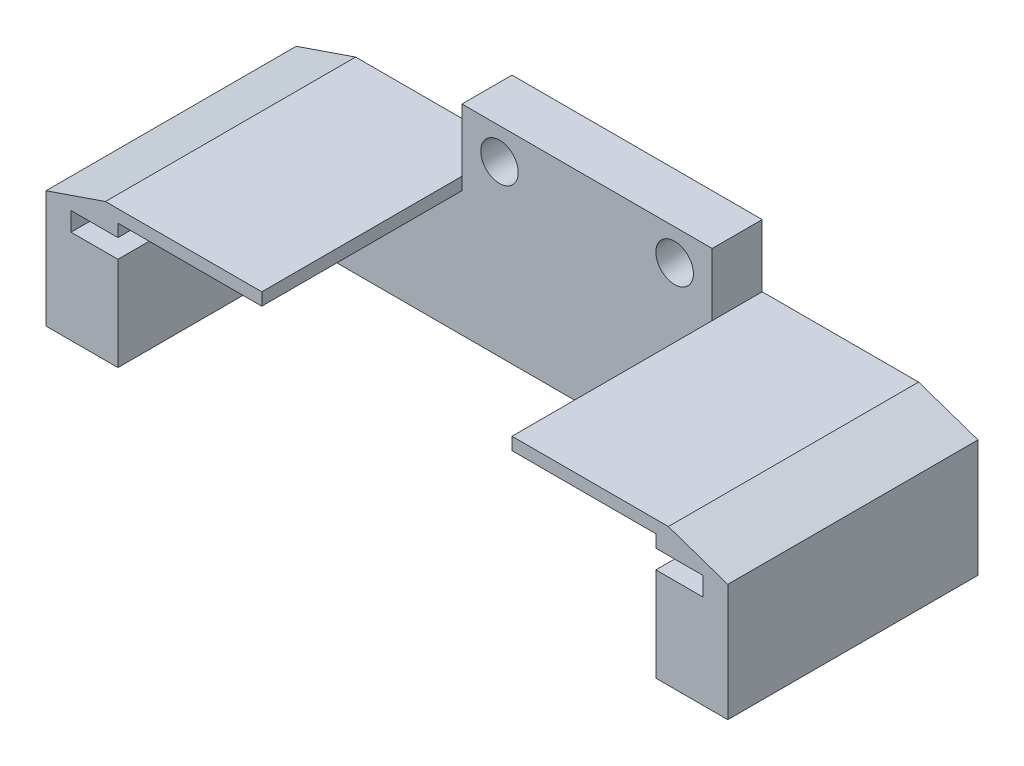
ISO-10303-21;
HEADER;
FILE_DESCRIPTION(('STEP AP214'),'2;1');
FILE_NAME('part.step','',(''),(''),'','','');
FILE_SCHEMA(('AUTOMOTIVE_DESIGN { 1 0 10303 214 1 1 1 1 }'));
ENDSEC;
DATA;
#1=APPLICATION_CONTEXT('core data for automotive mechanical design processes');
#2=APPLICATION_PROTOCOL_DEFINITION('international standard','automotive_design',2000,#1);
#3=PRODUCT_CONTEXT('',#1,'mechanical');
#4=PRODUCT('Part','Part','',(#3));
#5=PRODUCT_RELATED_PRODUCT_CATEGORY('part','',(#4));
#6=PRODUCT_DEFINITION_FORMATION('','',#4);
#7=PRODUCT_DEFINITION_CONTEXT('part definition',#1,'design');
#8=PRODUCT_DEFINITION('design','',#6,#7);
#9=PRODUCT_DEFINITION_SHAPE('','',#8);
#10=(LENGTH_UNIT() NAMED_UNIT(*) SI_UNIT(.MILLI.,.METRE.));
#11=(NAMED_UNIT(*) PLANE_ANGLE_UNIT() SI_UNIT($,.RADIAN.));
#12=(NAMED_UNIT(*) SI_UNIT($,.STERADIAN.) SOLID_ANGLE_UNIT());
#13=UNCERTAINTY_MEASURE_WITH_UNIT(LENGTH_MEASURE(1.E-05),#10,'distance_accuracy_value','');
#14=(GEOMETRIC_REPRESENTATION_CONTEXT(3) GLOBAL_UNCERTAINTY_ASSIGNED_CONTEXT((#13)) GLOBAL_UNIT_ASSIGNED_CONTEXT((#10,
#11,#12)) REPRESENTATION_CONTEXT('',''));
#15=CARTESIAN_POINT('',(0.,0.,0.));
#16=DIRECTION('',(0.,0.,1.));
#17=DIRECTION('',(1.,0.,0.));
#18=AXIS2_PLACEMENT_3D('',#15,#16,#17);
#19=CARTESIAN_POINT('',(-39.4079919345789,27.1123089983022,0.));
#20=DIRECTION('',(-1.,0.,0.));
#21=DIRECTION('',(0.,0.,1.));
#22=AXIS2_PLACEMENT_3D('',#19,#20,#21);
#23=PLANE('',#22);
#24=DIRECTION('',(0.,-1.,0.));
#25=VECTOR('',#24,1.);
#26=CARTESIAN_POINT('',(-39.4079919345789,26.1123089983022,1.));
#27=LINE('',#26,#25);
#28=CARTESIAN_POINT('',(-39.4079919345789,21.1123089983022,1.));
#29=VERTEX_POINT('',#28);
#30=CARTESIAN_POINT('',(-39.4079919345789,20.1123089983022,1.));
#31=VERTEX_POINT('',#30);
#32=EDGE_CURVE('E261',#29,#31,#27,.T.);
#33=ORIENTED_EDGE('',*,*,#32,.F.);
#34=DIRECTION('',(0.,0.,1.));
#35=VECTOR('',#34,1.);
#36=CARTESIAN_POINT('',(-39.4079919345789,21.1123089983022,0.));
#37=LINE('',#36,#35);
#38=CARTESIAN_POINT('',(-39.4079919345789,21.1123089983022,17.));
#39=VERTEX_POINT('',#38);
#40=EDGE_CURVE('E286',#29,#39,#37,.T.);
#41=ORIENTED_EDGE('',*,*,#40,.T.);
#42=DIRECTION('',(0.,-1.,0.));
#43=VECTOR('',#42,1.);
#44=CARTESIAN_POINT('',(-39.4079919345789,27.1123089983022,17.));
#45=LINE('',#44,#43);
#46=CARTESIAN_POINT('',(-39.4079919345789,20.1123089983022,17.));
#47=VERTEX_POINT('',#46);
#48=EDGE_CURVE('E292',#39,#47,#45,.T.);
#49=ORIENTED_EDGE('',*,*,#48,.T.);
#50=DIRECTION('',(0.,0.,1.));
#51=VECTOR('',#50,1.);
#52=CARTESIAN_POINT('',(-39.4079919345789,20.1123089983022,1.));
#53=LINE('',#52,#51);
#54=EDGE_CURVE('E41',#31,#47,#53,.T.);
#55=ORIENTED_EDGE('',*,*,#54,.F.);
#56=EDGE_LOOP('',(#33,#41,#49,#55));
#57=FACE_BOUND('',#56,.T.);
#58=ADVANCED_FACE('F33',(#57),#23,.F.);
#59=CARTESIAN_POINT('',(-19.4079919345789,27.1123089983022,0.));
#60=DIRECTION('',(1.,0.,0.));
#61=DIRECTION('',(0.,0.,-1.));
#62=AXIS2_PLACEMENT_3D('',#59,#60,#61);
#63=PLANE('',#62);
#64=DIRECTION('',(0.,-1.,0.));
#65=VECTOR('',#64,1.);
#66=CARTESIAN_POINT('',(-19.4079919345789,26.1123089983022,1.));
#67=LINE('',#66,#65);
#68=CARTESIAN_POINT('',(-19.4079919345789,21.1123089983022,1.));
#69=VERTEX_POINT('',#68);
#70=CARTESIAN_POINT('',(-19.4079919345789,20.1123089983022,1.));
#71=VERTEX_POINT('',#70);
#72=EDGE_CURVE('E257',#69,#71,#67,.T.);
#73=ORIENTED_EDGE('',*,*,#72,.T.);
#74=DIRECTION('',(0.,0.,-1.));
#75=VECTOR('',#74,1.);
#76=CARTESIAN_POINT('',(-19.4079919345789,20.1123089983022,1.));
#77=LINE('',#76,#75);
#78=CARTESIAN_POINT('',(-19.4079919345789,20.1123089983022,17.));
#79=VERTEX_POINT('',#78);
#80=EDGE_CURVE('E387',#79,#71,#77,.T.);
#81=ORIENTED_EDGE('',*,*,#80,.F.);
#82=DIRECTION('',(0.,1.,0.));
#83=VECTOR('',#82,1.);
#84=CARTESIAN_POINT('',(-19.4079919345789,27.1123089983022,17.));
#85=LINE('',#84,#83);
#86=CARTESIAN_POINT('',(-19.4079919345789,21.1123089983022,17.));
#87=VERTEX_POINT('',#86);
#88=EDGE_CURVE('E289',#79,#87,#85,.T.);
#89=ORIENTED_EDGE('',*,*,#88,.T.);
#90=DIRECTION('',(0.,0.,-1.));
#91=VECTOR('',#90,1.);
#92=CARTESIAN_POINT('',(-19.4079919345789,21.1123089983022,0.));
#93=LINE('',#92,#91);
#94=EDGE_CURVE('E11',#87,#69,#93,.T.);
#95=ORIENTED_EDGE('',*,*,#94,.T.);
#96=EDGE_LOOP('',(#73,#81,#89,#95));
#97=FACE_BOUND('',#96,.T.);
#98=ADVANCED_FACE('F460',(#97),#63,.F.);
#99=CARTESIAN_POINT('',(-50.9079919345788,10.1123089983022,1.));
#100=DIRECTION('',(-1.,0.,0.));
#101=DIRECTION('',(0.,0.,1.));
#102=AXIS2_PLACEMENT_3D('',#99,#100,#101);
#103=PLANE('',#102);
#104=DIRECTION('',(0.,-1.,0.));
#105=VECTOR('',#104,1.);
#106=CARTESIAN_POINT('',(-50.9079919345788,10.1123089983022,1.));
#107=LINE('',#106,#105);
#108=CARTESIAN_POINT('',(-50.9079919345788,17.6123089983022,1.));
#109=VERTEX_POINT('',#108);
#110=CARTESIAN_POINT('',(-50.9079919345788,10.1123089983022,1.));
#111=VERTEX_POINT('',#110);
#112=EDGE_CURVE('E345',#109,#111,#107,.T.);
#113=ORIENTED_EDGE('',*,*,#112,.F.);
#114=DIRECTION('',(0.,0.,1.));
#115=VECTOR('',#114,1.);
#116=CARTESIAN_POINT('',(-50.9079919345788,17.6123089983022,1.));
#117=LINE('',#116,#115);
#118=CARTESIAN_POINT('',(-50.9079919345788,17.6123089983022,17.));
#119=VERTEX_POINT('',#118);
#120=EDGE_CURVE('E337',#109,#119,#117,.T.);
#121=ORIENTED_EDGE('',*,*,#120,.T.);
#122=DIRECTION('',(0.,-1.,0.));
#123=VECTOR('',#122,1.);
#124=CARTESIAN_POINT('',(-50.9079919345788,10.1123089983022,17.));
#125=LINE('',#124,#123);
#126=CARTESIAN_POINT('',(-50.9079919345788,10.1123089983022,17.));
#127=VERTEX_POINT('',#126);
#128=EDGE_CURVE('E340',#119,#127,#125,.T.);
#129=ORIENTED_EDGE('',*,*,#128,.T.);
#130=DIRECTION('',(0.,0.,1.));
#131=VECTOR('',#130,1.);
#132=CARTESIAN_POINT('',(-50.9079919345788,10.1123089983022,1.));
#133=LINE('',#132,#131);
#134=EDGE_CURVE('E353',#111,#127,#133,.T.);
#135=ORIENTED_EDGE('',*,*,#134,.F.);
#136=EDGE_LOOP('',(#113,#121,#129,#135));
#137=FACE_BOUND('',#136,.T.);
#138=ADVANCED_FACE('F433',(#137),#103,.F.);
#139=CARTESIAN_POINT('',(-7.90799193457886,10.1123089983022,1.));
#140=DIRECTION('',(1.,0.,0.));
#141=DIRECTION('',(0.,1.,0.));
#142=AXIS2_PLACEMENT_3D('',#139,#140,#141);
#143=PLANE('',#142);
#144=DIRECTION('',(0.,1.,0.));
#145=VECTOR('',#144,1.);
#146=CARTESIAN_POINT('',(-7.90799193457886,10.1123089983022,17.));
#147=LINE('',#146,#145);
#148=CARTESIAN_POINT('',(-7.90799193457886,10.1123089983022,17.));
#149=VERTEX_POINT('',#148);
#150=CARTESIAN_POINT('',(-7.90799193457886,17.6123089983022,17.));
#151=VERTEX_POINT('',#150);
#152=EDGE_CURVE('E358',#149,#151,#147,.T.);
#153=ORIENTED_EDGE('',*,*,#152,.T.);
#154=DIRECTION('',(0.,0.,-1.));
#155=VECTOR('',#154,1.);
#156=CARTESIAN_POINT('',(-7.90799193457886,17.6123089983022,1.));
#157=LINE('',#156,#155);
#158=CARTESIAN_POINT('',(-7.90799193457886,17.6123089983022,1.));
#159=VERTEX_POINT('',#158);
#160=EDGE_CURVE('E384',#151,#159,#157,.T.);
#161=ORIENTED_EDGE('',*,*,#160,.T.);
#162=DIRECTION('',(0.,1.,0.));
#163=VECTOR('',#162,1.);
#164=CARTESIAN_POINT('',(-7.90799193457886,10.1123089983022,1.));
#165=LINE('',#164,#163);
#166=CARTESIAN_POINT('',(-7.90799193457886,10.1123089983022,1.));
#167=VERTEX_POINT('',#166);
#168=EDGE_CURVE('E346',#167,#159,#165,.T.);
#169=ORIENTED_EDGE('',*,*,#168,.F.);
#170=DIRECTION('',(0.,0.,1.));
#171=VECTOR('',#170,1.);
#172=CARTESIAN_POINT('',(-7.90799193457886,10.1123089983022,1.));
#173=LINE('',#172,#171);
#174=EDGE_CURVE('E372',#167,#149,#173,.T.);
#175=ORIENTED_EDGE('',*,*,#174,.T.);
#176=EDGE_LOOP('',(#153,#161,#169,#175));
#177=FACE_BOUND('',#176,.T.);
#178=ADVANCED_FACE('F501',(#177),#143,.F.);
#179=CARTESIAN_POINT('',(0.,0.,17.));
#180=DIRECTION('',(0.,0.,1.));
#181=DIRECTION('',(1.,0.,0.));
#182=AXIS2_PLACEMENT_3D('',#179,#180,#181);
#183=PLANE('',#182);
#184=DIRECTION('',(0.,-1.,0.));
#185=VECTOR('',#184,1.);
#186=CARTESIAN_POINT('',(-2.15799193457886,19.7408804268736,17.));
#187=LINE('',#186,#185);
#188=CARTESIAN_POINT('',(-2.15799193457886,19.4837375697308,17.));
#189=VERTEX_POINT('',#188);
#190=CARTESIAN_POINT('',(-2.15799193457886,10.1123089983022,17.));
#191=VERTEX_POINT('',#190);
#192=EDGE_CURVE('E228',#189,#191,#187,.T.);
#193=ORIENTED_EDGE('',*,*,#192,.F.);
#194=DIRECTION('',(0.945945945945946,-0.324324324324323,0.));
#195=VECTOR('',#194,1.);
#196=CARTESIAN_POINT('',(-6.90799193457886,21.1123089983022,17.));
#197=LINE('',#196,#195);
#198=CARTESIAN_POINT('',(-6.90799193457886,21.1123089983022,17.));
#199=VERTEX_POINT('',#198);
#200=EDGE_CURVE('E48',#199,#189,#197,.T.);
#201=ORIENTED_EDGE('',*,*,#200,.F.);
#202=DIRECTION('',(1.,0.,0.));
#203=VECTOR('',#202,1.);
#204=CARTESIAN_POINT('',(-3.90799193457886,21.1123089983022,17.));
#205=LINE('',#204,#203);
#206=EDGE_CURVE('E297',#87,#199,#205,.T.);
#207=ORIENTED_EDGE('',*,*,#206,.F.);
#208=ORIENTED_EDGE('',*,*,#88,.F.);
#209=DIRECTION('',(-1.,0.,0.));
#210=VECTOR('',#209,1.);
#211=CARTESIAN_POINT('',(-50.9079919345788,20.1123089983022,17.));
#212=LINE('',#211,#210);
#213=CARTESIAN_POINT('',(-7.90799193457886,20.1123089983022,17.));
#214=VERTEX_POINT('',#213);
#215=EDGE_CURVE('E362',#214,#79,#212,.T.);
#216=ORIENTED_EDGE('',*,*,#215,.F.);
#217=CARTESIAN_POINT('',(-7.90799193457886,19.1123089983022,17.));
#218=VERTEX_POINT('',#217);
#219=EDGE_CURVE('E357',#218,#214,#147,.T.);
#220=ORIENTED_EDGE('',*,*,#219,.F.);
#221=DIRECTION('',(-1.,0.,0.));
#222=VECTOR('',#221,1.);
#223=CARTESIAN_POINT('',(-4.15799193457886,19.1123089983022,17.));
#224=LINE('',#223,#222);
#225=CARTESIAN_POINT('',(-4.15799193457886,19.1123089983022,17.));
#226=VERTEX_POINT('',#225);
#227=EDGE_CURVE('E318',#226,#218,#224,.T.);
#228=ORIENTED_EDGE('',*,*,#227,.F.);
#229=DIRECTION('',(0.,1.,0.));
#230=VECTOR('',#229,1.);
#231=CARTESIAN_POINT('',(-4.15799193457886,17.6123089983022,17.));
#232=LINE('',#231,#230);
#233=CARTESIAN_POINT('',(-4.15799193457886,17.6123089983022,17.));
#234=VERTEX_POINT('',#233);
#235=EDGE_CURVE('E300',#234,#226,#232,.T.);
#236=ORIENTED_EDGE('',*,*,#235,.F.);
#237=DIRECTION('',(1.,0.,0.));
#238=VECTOR('',#237,1.);
#239=CARTESIAN_POINT('',(-4.15799193457886,17.6123089983022,17.));
#240=LINE('',#239,#238);
#241=EDGE_CURVE('E323',#151,#234,#240,.T.);
#242=ORIENTED_EDGE('',*,*,#241,.F.);
#243=ORIENTED_EDGE('',*,*,#152,.F.);
#244=DIRECTION('',(1.,0.,0.));
#245=VECTOR('',#244,1.);
#246=CARTESIAN_POINT('',(-54.9079919345788,10.1123089983022,17.));
#247=LINE('',#246,#245);
#248=EDGE_CURVE('E377',#149,#191,#247,.T.);
#249=ORIENTED_EDGE('',*,*,#248,.T.);
#250=EDGE_LOOP('',(#193,#201,#207,#208,#216,#220,#228,#236,#242,#243,#249));
#251=FACE_BOUND('',#250,.T.);
#252=ADVANCED_FACE('F481',(#251),#183,.T.);
#253=CARTESIAN_POINT('',(-54.9079919345788,10.1123089983022,17.));
#254=DIRECTION('',(0.,1.,0.));
#255=DIRECTION('',(0.,0.,1.));
#256=AXIS2_PLACEMENT_3D('',#253,#254,#255);
#257=PLANE('',#256);
#258=ORIENTED_EDGE('',*,*,#248,.F.);
#259=ORIENTED_EDGE('',*,*,#174,.F.);
#260=DIRECTION('',(1.,0.,0.));
#261=VECTOR('',#260,1.);
#262=CARTESIAN_POINT('',(-36.9079919345788,10.1123089983022,1.));
#263=LINE('',#262,#261);
#264=EDGE_CURVE('E368',#111,#167,#263,.T.);
#265=ORIENTED_EDGE('',*,*,#264,.F.);
#266=ORIENTED_EDGE('',*,*,#134,.T.);
#267=CARTESIAN_POINT('',(-56.6579919345789,10.1123089983022,17.));
#268=VERTEX_POINT('',#267);
#269=EDGE_CURVE('E378',#268,#127,#247,.T.);
#270=ORIENTED_EDGE('',*,*,#269,.F.);
#271=DIRECTION('',(0.,0.,1.));
#272=VECTOR('',#271,1.);
#273=CARTESIAN_POINT('',(-56.6579919345789,10.1123089983022,17.));
#274=LINE('',#273,#272);
#275=CARTESIAN_POINT('',(-56.6579919345789,10.1123089983022,-3.));
#276=VERTEX_POINT('',#275);
#277=EDGE_CURVE('E233',#276,#268,#274,.T.);
#278=ORIENTED_EDGE('',*,*,#277,.F.);
#279=DIRECTION('',(-1.,0.,0.));
#280=VECTOR('',#279,1.);
#281=CARTESIAN_POINT('',(-2.90799193457886,10.1123089983022,-3.));
#282=LINE('',#281,#280);
#283=CARTESIAN_POINT('',(-2.15799193457886,10.1123089983022,-3.));
#284=VERTEX_POINT('',#283);
#285=EDGE_CURVE('E271',#284,#276,#282,.T.);
#286=ORIENTED_EDGE('',*,*,#285,.F.);
#287=DIRECTION('',(0.,0.,-1.));
#288=VECTOR('',#287,1.);
#289=CARTESIAN_POINT('',(-2.15799193457886,10.1123089983022,17.));
#290=LINE('',#289,#288);
#291=EDGE_CURVE('E222',#191,#284,#290,.T.);
#292=ORIENTED_EDGE('',*,*,#291,.F.);
#293=EDGE_LOOP('',(#258,#259,#265,#266,#270,#278,#286,#292));
#294=FACE_BOUND('',#293,.T.);
#295=ADVANCED_FACE('F35',(#294),#257,.F.);
#296=DIRECTION('',(0.945945945945946,0.324324324324324,0.));
#297=VECTOR('',#296,1.);
#298=CARTESIAN_POINT('',(-55.9079919345788,19.7408804268736,17.));
#299=LINE('',#298,#297);
#300=CARTESIAN_POINT('',(-56.6579919345789,19.4837375697308,17.));
#301=VERTEX_POINT('',#300);
#302=CARTESIAN_POINT('',(-51.9079919345788,21.1123089983022,17.));
#303=VERTEX_POINT('',#302);
#304=EDGE_CURVE('E281',#301,#303,#299,.T.);
#305=ORIENTED_EDGE('',*,*,#304,.F.);
#306=DIRECTION('',(0.,1.,0.));
#307=VECTOR('',#306,1.);
#308=CARTESIAN_POINT('',(-56.6579919345789,19.7408804268736,17.));
#309=LINE('',#308,#307);
#310=EDGE_CURVE('E223',#268,#301,#309,.T.);
#311=ORIENTED_EDGE('',*,*,#310,.F.);
#312=ORIENTED_EDGE('',*,*,#269,.T.);
#313=ORIENTED_EDGE('',*,*,#128,.F.);
#314=CARTESIAN_POINT('',(-54.6579919345788,17.6123089983022,17.));
#315=VERTEX_POINT('',#314);
#316=EDGE_CURVE('E305',#315,#119,#240,.T.);
#317=ORIENTED_EDGE('',*,*,#316,.F.);
#318=DIRECTION('',(0.,-1.,0.));
#319=VECTOR('',#318,1.);
#320=CARTESIAN_POINT('',(-54.6579919345788,17.6123089983022,17.));
#321=LINE('',#320,#319);
#322=CARTESIAN_POINT('',(-54.6579919345788,19.1123089983022,17.));
#323=VERTEX_POINT('',#322);
#324=EDGE_CURVE('E320',#323,#315,#321,.T.);
#325=ORIENTED_EDGE('',*,*,#324,.F.);
#326=CARTESIAN_POINT('',(-50.9079919345788,19.1123089983022,17.));
#327=VERTEX_POINT('',#326);
#328=EDGE_CURVE('E317',#327,#323,#224,.T.);
#329=ORIENTED_EDGE('',*,*,#328,.F.);
#330=CARTESIAN_POINT('',(-50.9079919345788,20.1123089983022,17.));
#331=VERTEX_POINT('',#330);
#332=EDGE_CURVE('E354',#331,#327,#125,.T.);
#333=ORIENTED_EDGE('',*,*,#332,.F.);
#334=EDGE_CURVE('E361',#47,#331,#212,.T.);
#335=ORIENTED_EDGE('',*,*,#334,.F.);
#336=ORIENTED_EDGE('',*,*,#48,.F.);
#337=DIRECTION('',(1.,0.,0.));
#338=VECTOR('',#337,1.);
#339=CARTESIAN_POINT('',(-54.9079919345788,21.1123089983022,17.));
#340=LINE('',#339,#338);
#341=EDGE_CURVE('E294',#303,#39,#340,.T.);
#342=ORIENTED_EDGE('',*,*,#341,.F.);
#343=EDGE_LOOP('',(#305,#311,#312,#313,#317,#325,#329,#333,#335,#336,#342));
#344=FACE_BOUND('',#343,.T.);
#345=ADVANCED_FACE('F401',(#344),#183,.T.);
#346=CARTESIAN_POINT('',(-36.9079919345788,27.1123089983022,1.));
#347=DIRECTION('',(0.,0.,-1.));
#348=DIRECTION('',(-1.,0.,0.));
#349=AXIS2_PLACEMENT_3D('',#346,#347,#348);
#350=PLANE('',#349);
#351=CARTESIAN_POINT('',(-22.4079919345789,23.6123089983022,1.));
#352=DIRECTION('',(0.,0.,1.));
#353=DIRECTION('',(1.,0.,0.));
#354=AXIS2_PLACEMENT_3D('',#351,#352,#353);
#355=CIRCLE('',#354,1.5);
#356=CARTESIAN_POINT('',(-20.9079919345789,23.6123089983022,1.));
#357=VERTEX_POINT('',#356);
#358=EDGE_CURVE('E236',#357,#357,#355,.T.);
#359=ORIENTED_EDGE('',*,*,#358,.F.);
#360=EDGE_LOOP('',(#359));
#361=FACE_BOUND('',#360,.T.);
#362=CARTESIAN_POINT('',(-36.4079919345789,23.6123089983022,1.));
#363=DIRECTION('',(0.,0.,1.));
#364=DIRECTION('',(1.,0.,0.));
#365=AXIS2_PLACEMENT_3D('',#362,#363,#364);
#366=CIRCLE('',#365,1.5);
#367=CARTESIAN_POINT('',(-34.9079919345789,23.6123089983022,1.));
#368=VERTEX_POINT('',#367);
#369=EDGE_CURVE('E240',#368,#368,#366,.T.);
#370=ORIENTED_EDGE('',*,*,#369,.F.);
#371=EDGE_LOOP('',(#370));
#372=FACE_BOUND('',#371,.T.);
#373=DIRECTION('',(-1.,0.,0.));
#374=VECTOR('',#373,1.);
#375=CARTESIAN_POINT('',(-50.9079919345788,20.1123089983022,1.));
#376=LINE('',#375,#374);
#377=CARTESIAN_POINT('',(-7.90799193457886,20.1123089983022,1.));
#378=VERTEX_POINT('',#377);
#379=EDGE_CURVE('E350',#378,#71,#376,.T.);
#380=ORIENTED_EDGE('',*,*,#379,.T.);
#381=ORIENTED_EDGE('',*,*,#72,.F.);
#382=CARTESIAN_POINT('',(-19.4079919345789,26.1123089983022,1.));
#383=VERTEX_POINT('',#382);
#384=EDGE_CURVE('E258',#383,#69,#67,.T.);
#385=ORIENTED_EDGE('',*,*,#384,.F.);
#386=DIRECTION('',(1.,0.,0.));
#387=VECTOR('',#386,1.);
#388=CARTESIAN_POINT('',(-19.4079919345789,26.1123089983022,1.));
#389=LINE('',#388,#387);
#390=CARTESIAN_POINT('',(-39.4079919345789,26.1123089983022,1.));
#391=VERTEX_POINT('',#390);
#392=EDGE_CURVE('E255',#391,#383,#389,.T.);
#393=ORIENTED_EDGE('',*,*,#392,.F.);
#394=EDGE_CURVE('E262',#391,#29,#27,.T.);
#395=ORIENTED_EDGE('',*,*,#394,.T.);
#396=ORIENTED_EDGE('',*,*,#32,.T.);
#397=CARTESIAN_POINT('',(-50.9079919345788,20.1123089983022,1.));
#398=VERTEX_POINT('',#397);
#399=EDGE_CURVE('E349',#31,#398,#376,.T.);
#400=ORIENTED_EDGE('',*,*,#399,.T.);
#401=CARTESIAN_POINT('',(-50.9079919345788,19.1123089983022,1.));
#402=VERTEX_POINT('',#401);
#403=EDGE_CURVE('E341',#398,#402,#107,.T.);
#404=ORIENTED_EDGE('',*,*,#403,.T.);
#405=DIRECTION('',(-1.,0.,0.));
#406=VECTOR('',#405,1.);
#407=CARTESIAN_POINT('',(-4.15799193457886,19.1123089983022,1.));
#408=LINE('',#407,#406);
#409=CARTESIAN_POINT('',(-54.6579919345788,19.1123089983022,1.));
#410=VERTEX_POINT('',#409);
#411=EDGE_CURVE('E304',#402,#410,#408,.T.);
#412=ORIENTED_EDGE('',*,*,#411,.T.);
#413=DIRECTION('',(0.,-1.,0.));
#414=VECTOR('',#413,1.);
#415=CARTESIAN_POINT('',(-54.6579919345788,17.6123089983022,1.));
#416=LINE('',#415,#414);
#417=CARTESIAN_POINT('',(-54.6579919345788,17.6123089983022,1.));
#418=VERTEX_POINT('',#417);
#419=EDGE_CURVE('E308',#410,#418,#416,.T.);
#420=ORIENTED_EDGE('',*,*,#419,.T.);
#421=DIRECTION('',(1.,0.,0.));
#422=VECTOR('',#421,1.);
#423=CARTESIAN_POINT('',(-4.15799193457886,17.6123089983022,1.));
#424=LINE('',#423,#422);
#425=EDGE_CURVE('E312',#418,#109,#424,.T.);
#426=ORIENTED_EDGE('',*,*,#425,.T.);
#427=ORIENTED_EDGE('',*,*,#112,.T.);
#428=ORIENTED_EDGE('',*,*,#264,.T.);
#429=ORIENTED_EDGE('',*,*,#168,.T.);
#430=CARTESIAN_POINT('',(-4.15799193457886,17.6123089983022,1.));
#431=VERTEX_POINT('',#430);
#432=EDGE_CURVE('E311',#159,#431,#424,.T.);
#433=ORIENTED_EDGE('',*,*,#432,.T.);
#434=DIRECTION('',(0.,1.,0.));
#435=VECTOR('',#434,1.);
#436=CARTESIAN_POINT('',(-4.15799193457886,17.6123089983022,1.));
#437=LINE('',#436,#435);
#438=CARTESIAN_POINT('',(-4.15799193457886,19.1123089983022,1.));
#439=VERTEX_POINT('',#438);
#440=EDGE_CURVE('E301',#431,#439,#437,.T.);
#441=ORIENTED_EDGE('',*,*,#440,.T.);
#442=CARTESIAN_POINT('',(-7.90799193457886,19.1123089983022,1.));
#443=VERTEX_POINT('',#442);
#444=EDGE_CURVE('E306',#439,#443,#408,.T.);
#445=ORIENTED_EDGE('',*,*,#444,.T.);
#446=EDGE_CURVE('E344',#443,#378,#165,.T.);
#447=ORIENTED_EDGE('',*,*,#446,.T.);
#448=EDGE_LOOP('',(#380,#381,#385,#393,#395,#396,#400,#404,#412,#420,#426,#427,#428,#429,#433,
#441,#445,#447));
#449=FACE_BOUND('',#448,.T.);
#450=ADVANCED_FACE('F409',(#361,#372,#449),#350,.F.);
#451=CARTESIAN_POINT('',(-50.9079919345788,20.1123089983022,1.));
#452=DIRECTION('',(0.,1.,0.));
#453=DIRECTION('',(0.,0.,1.));
#454=AXIS2_PLACEMENT_3D('',#451,#452,#453);
#455=PLANE('',#454);
#456=ORIENTED_EDGE('',*,*,#399,.F.);
#457=ORIENTED_EDGE('',*,*,#54,.T.);
#458=ORIENTED_EDGE('',*,*,#334,.T.);
#459=DIRECTION('',(0.,0.,1.));
#460=VECTOR('',#459,1.);
#461=CARTESIAN_POINT('',(-50.9079919345788,20.1123089983022,1.));
#462=LINE('',#461,#460);
#463=EDGE_CURVE('E365',#398,#331,#462,.T.);
#464=ORIENTED_EDGE('',*,*,#463,.F.);
#465=EDGE_LOOP('',(#456,#457,#458,#464));
#466=FACE_BOUND('',#465,.T.);
#467=ADVANCED_FACE('F394',(#466),#455,.F.);
#468=ORIENTED_EDGE('',*,*,#332,.T.);
#469=DIRECTION('',(0.,0.,-1.));
#470=VECTOR('',#469,1.);
#471=CARTESIAN_POINT('',(-50.9079919345788,19.1123089983022,1.));
#472=LINE('',#471,#470);
#473=EDGE_CURVE('E328',#327,#402,#472,.T.);
#474=ORIENTED_EDGE('',*,*,#473,.T.);
#475=ORIENTED_EDGE('',*,*,#403,.F.);
#476=ORIENTED_EDGE('',*,*,#463,.T.);
#477=EDGE_LOOP('',(#468,#474,#475,#476));
#478=FACE_BOUND('',#477,.T.);
#479=ADVANCED_FACE('F406',(#478),#103,.F.);
#480=ORIENTED_EDGE('',*,*,#215,.T.);
#481=ORIENTED_EDGE('',*,*,#80,.T.);
#482=ORIENTED_EDGE('',*,*,#379,.F.);
#483=DIRECTION('',(0.,0.,1.));
#484=VECTOR('',#483,1.);
#485=CARTESIAN_POINT('',(-7.90799193457886,20.1123089983022,1.));
#486=LINE('',#485,#484);
#487=EDGE_CURVE('E369',#378,#214,#486,.T.);
#488=ORIENTED_EDGE('',*,*,#487,.T.);
#489=EDGE_LOOP('',(#480,#481,#482,#488));
#490=FACE_BOUND('',#489,.T.);
#491=ADVANCED_FACE('F484',(#490),#455,.F.);
#492=ORIENTED_EDGE('',*,*,#446,.F.);
#493=DIRECTION('',(0.,0.,1.));
#494=VECTOR('',#493,1.);
#495=CARTESIAN_POINT('',(-7.90799193457886,19.1123089983022,1.));
#496=LINE('',#495,#494);
#497=EDGE_CURVE('E381',#443,#218,#496,.T.);
#498=ORIENTED_EDGE('',*,*,#497,.T.);
#499=ORIENTED_EDGE('',*,*,#219,.T.);
#500=ORIENTED_EDGE('',*,*,#487,.F.);
#501=EDGE_LOOP('',(#492,#498,#499,#500));
#502=FACE_BOUND('',#501,.T.);
#503=ADVANCED_FACE('F457',(#502),#143,.F.);
#504=CARTESIAN_POINT('',(-4.15799193457886,19.1123089983022,1.));
#505=DIRECTION('',(0.,1.,0.));
#506=DIRECTION('',(-1.,0.,0.));
#507=AXIS2_PLACEMENT_3D('',#504,#505,#506);
#508=PLANE('',#507);
#509=ORIENTED_EDGE('',*,*,#444,.F.);
#510=DIRECTION('',(0.,0.,1.));
#511=VECTOR('',#510,1.);
#512=CARTESIAN_POINT('',(-4.15799193457886,19.1123089983022,1.));
#513=LINE('',#512,#511);
#514=EDGE_CURVE('E314',#439,#226,#513,.T.);
#515=ORIENTED_EDGE('',*,*,#514,.T.);
#516=ORIENTED_EDGE('',*,*,#227,.T.);
#517=ORIENTED_EDGE('',*,*,#497,.F.);
#518=EDGE_LOOP('',(#509,#515,#516,#517));
#519=FACE_BOUND('',#518,.T.);
#520=ADVANCED_FACE('F445',(#519),#508,.F.);
#521=CARTESIAN_POINT('',(-4.15799193457886,17.6123089983022,1.));
#522=DIRECTION('',(0.,-1.,0.));
#523=DIRECTION('',(1.,0.,0.));
#524=AXIS2_PLACEMENT_3D('',#521,#522,#523);
#525=PLANE('',#524);
#526=ORIENTED_EDGE('',*,*,#241,.T.);
#527=DIRECTION('',(0.,0.,1.));
#528=VECTOR('',#527,1.);
#529=CARTESIAN_POINT('',(-4.15799193457886,17.6123089983022,1.));
#530=LINE('',#529,#528);
#531=EDGE_CURVE('E325',#431,#234,#530,.T.);
#532=ORIENTED_EDGE('',*,*,#531,.F.);
#533=ORIENTED_EDGE('',*,*,#432,.F.);
#534=ORIENTED_EDGE('',*,*,#160,.F.);
#535=EDGE_LOOP('',(#526,#532,#533,#534));
#536=FACE_BOUND('',#535,.T.);
#537=ADVANCED_FACE('F454',(#536),#525,.F.);
#538=CARTESIAN_POINT('',(-4.15799193457886,17.6123089983022,1.));
#539=DIRECTION('',(1.,0.,0.));
#540=DIRECTION('',(0.,0.,-1.));
#541=AXIS2_PLACEMENT_3D('',#538,#539,#540);
#542=PLANE('',#541);
#543=ORIENTED_EDGE('',*,*,#235,.T.);
#544=ORIENTED_EDGE('',*,*,#514,.F.);
#545=ORIENTED_EDGE('',*,*,#440,.F.);
#546=ORIENTED_EDGE('',*,*,#531,.T.);
#547=EDGE_LOOP('',(#543,#544,#545,#546));
#548=FACE_BOUND('',#547,.T.);
#549=ADVANCED_FACE('F452',(#548),#542,.F.);
#550=ORIENTED_EDGE('',*,*,#425,.F.);
#551=DIRECTION('',(0.,0.,1.));
#552=VECTOR('',#551,1.);
#553=CARTESIAN_POINT('',(-54.6579919345788,17.6123089983022,1.));
#554=LINE('',#553,#552);
#555=EDGE_CURVE('E329',#418,#315,#554,.T.);
#556=ORIENTED_EDGE('',*,*,#555,.T.);
#557=ORIENTED_EDGE('',*,*,#316,.T.);
#558=ORIENTED_EDGE('',*,*,#120,.F.);
#559=EDGE_LOOP('',(#550,#556,#557,#558));
#560=FACE_BOUND('',#559,.T.);
#561=ADVANCED_FACE('F437',(#560),#525,.F.);
#562=ORIENTED_EDGE('',*,*,#328,.T.);
#563=DIRECTION('',(0.,0.,1.));
#564=VECTOR('',#563,1.);
#565=CARTESIAN_POINT('',(-54.6579919345788,19.1123089983022,1.));
#566=LINE('',#565,#564);
#567=EDGE_CURVE('E331',#410,#323,#566,.T.);
#568=ORIENTED_EDGE('',*,*,#567,.F.);
#569=ORIENTED_EDGE('',*,*,#411,.F.);
#570=ORIENTED_EDGE('',*,*,#473,.F.);
#571=EDGE_LOOP('',(#562,#568,#569,#570));
#572=FACE_BOUND('',#571,.T.);
#573=ADVANCED_FACE('F442',(#572),#508,.F.);
#574=CARTESIAN_POINT('',(-54.6579919345788,17.6123089983022,1.));
#575=DIRECTION('',(-1.,0.,0.));
#576=DIRECTION('',(0.,0.,1.));
#577=AXIS2_PLACEMENT_3D('',#574,#575,#576);
#578=PLANE('',#577);
#579=ORIENTED_EDGE('',*,*,#324,.T.);
#580=ORIENTED_EDGE('',*,*,#555,.F.);
#581=ORIENTED_EDGE('',*,*,#419,.F.);
#582=ORIENTED_EDGE('',*,*,#567,.T.);
#583=EDGE_LOOP('',(#579,#580,#581,#582));
#584=FACE_BOUND('',#583,.T.);
#585=ADVANCED_FACE('F440',(#584),#578,.F.);
#586=CARTESIAN_POINT('',(-3.90799193457886,21.1123089983022,0.));
#587=DIRECTION('',(0.,-1.,0.));
#588=DIRECTION('',(0.,0.,-1.));
#589=AXIS2_PLACEMENT_3D('',#586,#587,#588);
#590=PLANE('',#589);
#591=ORIENTED_EDGE('',*,*,#94,.F.);
#592=ORIENTED_EDGE('',*,*,#206,.T.);
#593=DIRECTION('',(0.,0.,1.));
#594=VECTOR('',#593,1.);
#595=CARTESIAN_POINT('',(-6.90799193457886,21.1123089983022,0.));
#596=LINE('',#595,#594);
#597=CARTESIAN_POINT('',(-6.90799193457886,21.1123089983022,-3.));
#598=VERTEX_POINT('',#597);
#599=EDGE_CURVE('E279',#598,#199,#596,.T.);
#600=ORIENTED_EDGE('',*,*,#599,.F.);
#601=DIRECTION('',(1.,0.,0.));
#602=VECTOR('',#601,1.);
#603=CARTESIAN_POINT('',(-19.4079919345789,21.1123089983022,-3.));
#604=LINE('',#603,#602);
#605=CARTESIAN_POINT('',(-19.4079919345789,21.1123089983022,-3.));
#606=VERTEX_POINT('',#605);
#607=EDGE_CURVE('E211',#606,#598,#604,.T.);
#608=ORIENTED_EDGE('',*,*,#607,.F.);
#609=DIRECTION('',(0.,0.,-1.));
#610=VECTOR('',#609,1.);
#611=CARTESIAN_POINT('',(-19.4079919345789,21.1123089983022,0.));
#612=LINE('',#611,#610);
#613=EDGE_CURVE('E269',#69,#606,#612,.T.);
#614=ORIENTED_EDGE('',*,*,#613,.F.);
#615=EDGE_LOOP('',(#591,#592,#600,#608,#614));
#616=FACE_BOUND('',#615,.T.);
#617=ADVANCED_FACE('F450',(#616),#590,.F.);
#618=CARTESIAN_POINT('',(-54.9079919345788,21.1123089983022,0.));
#619=DIRECTION('',(0.,-1.,0.));
#620=DIRECTION('',(0.,0.,-1.));
#621=AXIS2_PLACEMENT_3D('',#618,#619,#620);
#622=PLANE('',#621);
#623=ORIENTED_EDGE('',*,*,#341,.T.);
#624=ORIENTED_EDGE('',*,*,#40,.F.);
#625=CARTESIAN_POINT('',(-39.4079919345789,21.1123089983022,-3.));
#626=VERTEX_POINT('',#625);
#627=EDGE_CURVE('E287',#626,#29,#37,.T.);
#628=ORIENTED_EDGE('',*,*,#627,.F.);
#629=DIRECTION('',(1.,0.,0.));
#630=VECTOR('',#629,1.);
#631=CARTESIAN_POINT('',(-51.9079919345788,21.1123089983022,-3.));
#632=LINE('',#631,#630);
#633=CARTESIAN_POINT('',(-51.9079919345788,21.1123089983022,-3.));
#634=VERTEX_POINT('',#633);
#635=EDGE_CURVE('E274',#634,#626,#632,.T.);
#636=ORIENTED_EDGE('',*,*,#635,.F.);
#637=DIRECTION('',(0.,0.,1.));
#638=VECTOR('',#637,1.);
#639=CARTESIAN_POINT('',(-51.9079919345788,21.1123089983022,0.));
#640=LINE('',#639,#638);
#641=EDGE_CURVE('E283',#634,#303,#640,.T.);
#642=ORIENTED_EDGE('',*,*,#641,.T.);
#643=EDGE_LOOP('',(#623,#624,#628,#636,#642));
#644=FACE_BOUND('',#643,.T.);
#645=ADVANCED_FACE('F416',(#644),#622,.F.);
#646=CARTESIAN_POINT('',(-55.9079919345788,19.7408804268736,0.));
#647=DIRECTION('',(0.324324324324324,-0.945945945945946,0.));
#648=DIRECTION('',(0.945945945945946,0.324324324324324,0.));
#649=AXIS2_PLACEMENT_3D('',#646,#647,#648);
#650=PLANE('',#649);
#651=ORIENTED_EDGE('',*,*,#304,.T.);
#652=ORIENTED_EDGE('',*,*,#641,.F.);
#653=DIRECTION('',(0.945945945945946,0.324324324324324,0.));
#654=VECTOR('',#653,1.);
#655=CARTESIAN_POINT('',(-55.9079919345788,19.7408804268736,-3.));
#656=LINE('',#655,#654);
#657=CARTESIAN_POINT('',(-56.6579919345789,19.4837375697308,-3.));
#658=VERTEX_POINT('',#657);
#659=EDGE_CURVE('E56',#658,#634,#656,.T.);
#660=ORIENTED_EDGE('',*,*,#659,.F.);
#661=DIRECTION('',(0.,0.,1.));
#662=VECTOR('',#661,1.);
#663=CARTESIAN_POINT('',(-56.6579919345789,19.4837375697308,-3.));
#664=LINE('',#663,#662);
#665=EDGE_CURVE('E217',#658,#301,#664,.T.);
#666=ORIENTED_EDGE('',*,*,#665,.T.);
#667=EDGE_LOOP('',(#651,#652,#660,#666));
#668=FACE_BOUND('',#667,.T.);
#669=ADVANCED_FACE('F419',(#668),#650,.F.);
#670=CARTESIAN_POINT('',(-6.90799193457886,21.1123089983022,0.));
#671=DIRECTION('',(-0.324324324324323,-0.945945945945946,0.));
#672=DIRECTION('',(0.945945945945947,-0.324324324324323,0.));
#673=AXIS2_PLACEMENT_3D('',#670,#671,#672);
#674=PLANE('',#673);
#675=ORIENTED_EDGE('',*,*,#200,.T.);
#676=DIRECTION('',(0.,0.,1.));
#677=VECTOR('',#676,1.);
#678=CARTESIAN_POINT('',(-2.15799193457886,19.4837375697308,-3.));
#679=LINE('',#678,#677);
#680=CARTESIAN_POINT('',(-2.15799193457886,19.4837375697308,-3.));
#681=VERTEX_POINT('',#680);
#682=EDGE_CURVE('E213',#681,#189,#679,.T.);
#683=ORIENTED_EDGE('',*,*,#682,.F.);
#684=DIRECTION('',(0.945945945945946,-0.324324324324323,0.));
#685=VECTOR('',#684,1.);
#686=CARTESIAN_POINT('',(-6.90799193457886,21.1123089983022,-3.));
#687=LINE('',#686,#685);
#688=EDGE_CURVE('E203',#598,#681,#687,.T.);
#689=ORIENTED_EDGE('',*,*,#688,.F.);
#690=ORIENTED_EDGE('',*,*,#599,.T.);
#691=EDGE_LOOP('',(#675,#683,#689,#690));
#692=FACE_BOUND('',#691,.T.);
#693=ADVANCED_FACE('F214',(#692),#674,.F.);
#694=CARTESIAN_POINT('',(0.,0.,-3.));
#695=DIRECTION('',(0.,0.,-1.));
#696=DIRECTION('',(-1.,0.,0.));
#697=AXIS2_PLACEMENT_3D('',#694,#695,#696);
#698=PLANE('',#697);
#699=ORIENTED_EDGE('',*,*,#688,.T.);
#700=DIRECTION('',(0.,1.,0.));
#701=VECTOR('',#700,1.);
#702=CARTESIAN_POINT('',(-2.15799193457886,19.7408804268736,-3.));
#703=LINE('',#702,#701);
#704=EDGE_CURVE('E208',#284,#681,#703,.T.);
#705=ORIENTED_EDGE('',*,*,#704,.F.);
#706=ORIENTED_EDGE('',*,*,#285,.T.);
#707=DIRECTION('',(0.,-1.,0.));
#708=VECTOR('',#707,1.);
#709=CARTESIAN_POINT('',(-56.6579919345789,19.7408804268736,-3.));
#710=LINE('',#709,#708);
#711=EDGE_CURVE('E226',#658,#276,#710,.T.);
#712=ORIENTED_EDGE('',*,*,#711,.F.);
#713=ORIENTED_EDGE('',*,*,#659,.T.);
#714=ORIENTED_EDGE('',*,*,#635,.T.);
#715=DIRECTION('',(0.,-1.,0.));
#716=VECTOR('',#715,1.);
#717=CARTESIAN_POINT('',(-39.4079919345789,26.1123089983022,-3.));
#718=LINE('',#717,#716);
#719=CARTESIAN_POINT('',(-39.4079919345789,26.1123089983022,-3.));
#720=VERTEX_POINT('',#719);
#721=EDGE_CURVE('E265',#720,#626,#718,.T.);
#722=ORIENTED_EDGE('',*,*,#721,.F.);
#723=DIRECTION('',(-1.,0.,0.));
#724=VECTOR('',#723,1.);
#725=CARTESIAN_POINT('',(-19.4079919345789,26.1123089983022,-3.));
#726=LINE('',#725,#724);
#727=CARTESIAN_POINT('',(-19.4079919345789,26.1123089983022,-3.));
#728=VERTEX_POINT('',#727);
#729=EDGE_CURVE('E251',#728,#720,#726,.T.);
#730=ORIENTED_EDGE('',*,*,#729,.F.);
#731=DIRECTION('',(0.,-1.,0.));
#732=VECTOR('',#731,1.);
#733=CARTESIAN_POINT('',(-19.4079919345789,26.1123089983022,-3.));
#734=LINE('',#733,#732);
#735=EDGE_CURVE('E267',#728,#606,#734,.T.);
#736=ORIENTED_EDGE('',*,*,#735,.T.);
#737=ORIENTED_EDGE('',*,*,#607,.T.);
#738=EDGE_LOOP('',(#699,#705,#706,#712,#713,#714,#722,#730,#736,#737));
#739=FACE_BOUND('',#738,.T.);
#740=CARTESIAN_POINT('',(-22.4079919345789,23.6123089983022,-3.));
#741=DIRECTION('',(0.,0.,1.));
#742=DIRECTION('',(1.,0.,0.));
#743=AXIS2_PLACEMENT_3D('',#740,#741,#742);
#744=CIRCLE('',#743,1.5);
#745=CARTESIAN_POINT('',(-20.9079919345789,23.6123089983022,-3.));
#746=VERTEX_POINT('',#745);
#747=EDGE_CURVE('E237',#746,#746,#744,.T.);
#748=ORIENTED_EDGE('',*,*,#747,.T.);
#749=EDGE_LOOP('',(#748));
#750=FACE_BOUND('',#749,.T.);
#751=CARTESIAN_POINT('',(-36.4079919345789,23.6123089983022,-3.));
#752=DIRECTION('',(0.,0.,1.));
#753=DIRECTION('',(1.,0.,0.));
#754=AXIS2_PLACEMENT_3D('',#751,#752,#753);
#755=CIRCLE('',#754,1.5);
#756=CARTESIAN_POINT('',(-34.9079919345789,23.6123089983022,-3.));
#757=VERTEX_POINT('',#756);
#758=EDGE_CURVE('E243',#757,#757,#755,.T.);
#759=ORIENTED_EDGE('',*,*,#758,.T.);
#760=EDGE_LOOP('',(#759));
#761=FACE_BOUND('',#760,.T.);
#762=ADVANCED_FACE('F204',(#739,#750,#761),#698,.T.);
#763=CARTESIAN_POINT('',(-19.4079919345789,26.1123089983022,1.));
#764=DIRECTION('',(-1.,0.,0.));
#765=DIRECTION('',(0.,0.,1.));
#766=AXIS2_PLACEMENT_3D('',#763,#764,#765);
#767=PLANE('',#766);
#768=ORIENTED_EDGE('',*,*,#384,.T.);
#769=ORIENTED_EDGE('',*,*,#613,.T.);
#770=ORIENTED_EDGE('',*,*,#735,.F.);
#771=DIRECTION('',(0.,0.,-1.));
#772=VECTOR('',#771,1.);
#773=CARTESIAN_POINT('',(-19.4079919345789,26.1123089983022,1.));
#774=LINE('',#773,#772);
#775=EDGE_CURVE('E246',#383,#728,#774,.T.);
#776=ORIENTED_EDGE('',*,*,#775,.F.);
#777=EDGE_LOOP('',(#768,#769,#770,#776));
#778=FACE_BOUND('',#777,.T.);
#779=ADVANCED_FACE('F507',(#778),#767,.F.);
#780=CARTESIAN_POINT('',(-39.4079919345789,26.1123089983022,1.));
#781=DIRECTION('',(1.,0.,0.));
#782=DIRECTION('',(0.,0.,-1.));
#783=AXIS2_PLACEMENT_3D('',#780,#781,#782);
#784=PLANE('',#783);
#785=ORIENTED_EDGE('',*,*,#721,.T.);
#786=ORIENTED_EDGE('',*,*,#627,.T.);
#787=ORIENTED_EDGE('',*,*,#394,.F.);
#788=DIRECTION('',(0.,0.,1.));
#789=VECTOR('',#788,1.);
#790=CARTESIAN_POINT('',(-39.4079919345789,26.1123089983022,1.));
#791=LINE('',#790,#789);
#792=EDGE_CURVE('E253',#720,#391,#791,.T.);
#793=ORIENTED_EDGE('',*,*,#792,.F.);
#794=EDGE_LOOP('',(#785,#786,#787,#793));
#795=FACE_BOUND('',#794,.T.);
#796=ADVANCED_FACE('F514',(#795),#784,.F.);
#797=CARTESIAN_POINT('',(0.,26.1123089983022,0.));
#798=DIRECTION('',(0.,1.,0.));
#799=DIRECTION('',(0.,0.,1.));
#800=AXIS2_PLACEMENT_3D('',#797,#798,#799);
#801=PLANE('',#800);
#802=ORIENTED_EDGE('',*,*,#775,.T.);
#803=ORIENTED_EDGE('',*,*,#729,.T.);
#804=ORIENTED_EDGE('',*,*,#792,.T.);
#805=ORIENTED_EDGE('',*,*,#392,.T.);
#806=EDGE_LOOP('',(#802,#803,#804,#805));
#807=FACE_BOUND('',#806,.T.);
#808=ADVANCED_FACE('F510',(#807),#801,.T.);
#809=CARTESIAN_POINT('',(-36.4079919345789,23.6123089983022,-3.));
#810=DIRECTION('',(0.,0.,1.));
#811=DIRECTION('',(1.,0.,0.));
#812=AXIS2_PLACEMENT_3D('',#809,#810,#811);
#813=CYLINDRICAL_SURFACE('',#812,1.5);
#814=ORIENTED_EDGE('',*,*,#758,.F.);
#815=EDGE_LOOP('',(#814));
#816=FACE_BOUND('',#815,.T.);
#817=ORIENTED_EDGE('',*,*,#369,.T.);
#818=EDGE_LOOP('',(#817));
#819=FACE_BOUND('',#818,.T.);
#820=ADVANCED_FACE('F521',(#816,#819),#813,.F.);
#821=CARTESIAN_POINT('',(-22.4079919345789,23.6123089983022,-3.));
#822=DIRECTION('',(0.,0.,1.));
#823=DIRECTION('',(1.,0.,0.));
#824=AXIS2_PLACEMENT_3D('',#821,#822,#823);
#825=CYLINDRICAL_SURFACE('',#824,1.5);
#826=ORIENTED_EDGE('',*,*,#747,.F.);
#827=EDGE_LOOP('',(#826));
#828=FACE_BOUND('',#827,.T.);
#829=ORIENTED_EDGE('',*,*,#358,.T.);
#830=EDGE_LOOP('',(#829));
#831=FACE_BOUND('',#830,.T.);
#832=ADVANCED_FACE('F582',(#828,#831),#825,.F.);
#833=CARTESIAN_POINT('',(-56.6579919345789,0.,0.));
#834=DIRECTION('',(1.,0.,0.));
#835=DIRECTION('',(0.,0.,-1.));
#836=AXIS2_PLACEMENT_3D('',#833,#834,#835);
#837=PLANE('',#836);
#838=ORIENTED_EDGE('',*,*,#310,.T.);
#839=ORIENTED_EDGE('',*,*,#665,.F.);
#840=ORIENTED_EDGE('',*,*,#711,.T.);
#841=ORIENTED_EDGE('',*,*,#277,.T.);
#842=EDGE_LOOP('',(#838,#839,#840,#841));
#843=FACE_BOUND('',#842,.T.);
#844=ADVANCED_FACE('F423',(#843),#837,.F.);
#845=CARTESIAN_POINT('',(-2.15799193457886,0.,0.));
#846=DIRECTION('',(1.,0.,0.));
#847=DIRECTION('',(0.,0.,-1.));
#848=AXIS2_PLACEMENT_3D('',#845,#846,#847);
#849=PLANE('',#848);
#850=ORIENTED_EDGE('',*,*,#682,.T.);
#851=ORIENTED_EDGE('',*,*,#192,.T.);
#852=ORIENTED_EDGE('',*,*,#291,.T.);
#853=ORIENTED_EDGE('',*,*,#704,.T.);
#854=EDGE_LOOP('',(#850,#851,#852,#853));
#855=FACE_BOUND('',#854,.T.);
#856=ADVANCED_FACE('F220',(#855),#849,.T.);
#857=CLOSED_SHELL('',(#58,#98,#138,#178,#252,#295,#345,#450,#467,#479,#491,#503,#520,#537,#549,
#561,#573,#585,#617,#645,#669,#693,#762,#779,#796,#808,#820,#832,#844,#856));
#858=MANIFOLD_SOLID_BREP('B2',#857);
#859=ADVANCED_BREP_SHAPE_REPRESENTATION('',(#18,#858),#14);
#860=SHAPE_DEFINITION_REPRESENTATION(#9,#859);
ENDSEC;
END-ISO-10303-21;
